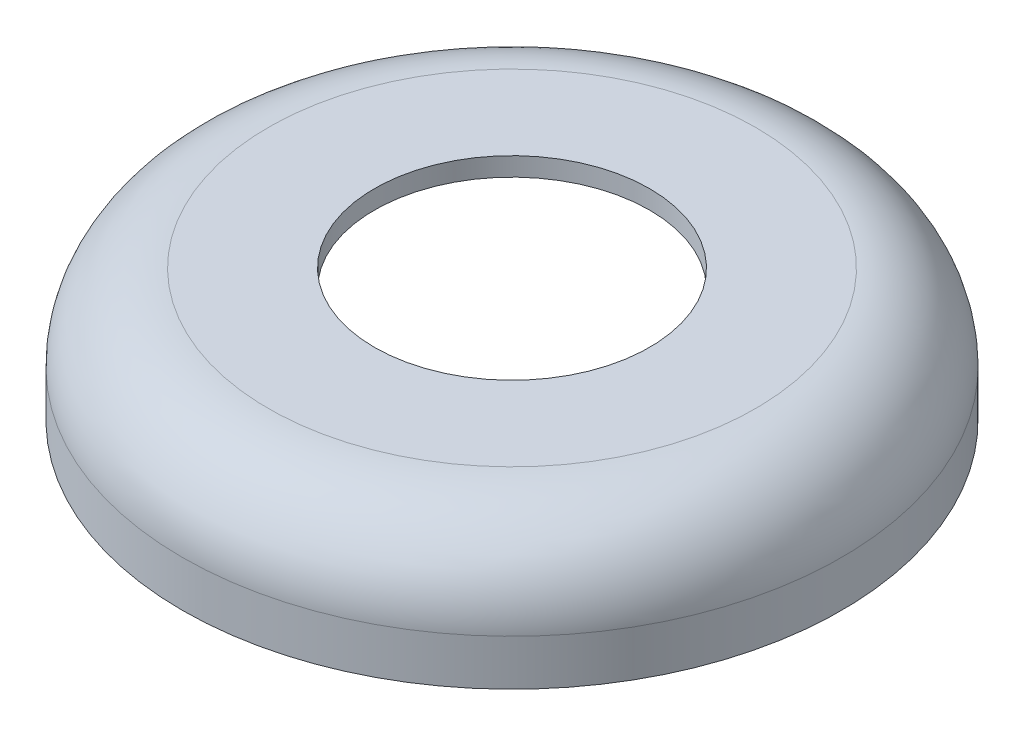
ISO-10303-21;
HEADER;
FILE_DESCRIPTION(('STEP AP214'),'2;1');
FILE_NAME('part.step','',(''),(''),'','','');
FILE_SCHEMA(('AUTOMOTIVE_DESIGN { 1 0 10303 214 1 1 1 1 }'));
ENDSEC;
DATA;
#1=APPLICATION_CONTEXT('core data for automotive mechanical design processes');
#2=APPLICATION_PROTOCOL_DEFINITION('international standard','automotive_design',2000,#1);
#3=PRODUCT_CONTEXT('',#1,'mechanical');
#4=PRODUCT('Part','Part','',(#3));
#5=PRODUCT_RELATED_PRODUCT_CATEGORY('part','',(#4));
#6=PRODUCT_DEFINITION_FORMATION('','',#4);
#7=PRODUCT_DEFINITION_CONTEXT('part definition',#1,'design');
#8=PRODUCT_DEFINITION('design','',#6,#7);
#9=PRODUCT_DEFINITION_SHAPE('','',#8);
#10=(LENGTH_UNIT() NAMED_UNIT(*) SI_UNIT(.MILLI.,.METRE.));
#11=(NAMED_UNIT(*) PLANE_ANGLE_UNIT() SI_UNIT($,.RADIAN.));
#12=(NAMED_UNIT(*) SI_UNIT($,.STERADIAN.) SOLID_ANGLE_UNIT());
#13=UNCERTAINTY_MEASURE_WITH_UNIT(LENGTH_MEASURE(1.E-05),#10,'distance_accuracy_value','');
#14=(GEOMETRIC_REPRESENTATION_CONTEXT(3) GLOBAL_UNCERTAINTY_ASSIGNED_CONTEXT((#13)) GLOBAL_UNIT_ASSIGNED_CONTEXT((#10,
#11,#12)) REPRESENTATION_CONTEXT('',''));
#15=CARTESIAN_POINT('',(0.,0.,0.));
#16=DIRECTION('',(0.,0.,1.));
#17=DIRECTION('',(1.,0.,0.));
#18=AXIS2_PLACEMENT_3D('',#15,#16,#17);
#19=CARTESIAN_POINT('',(0.,4.6,0.));
#20=DIRECTION('',(0.,1.,0.));
#21=DIRECTION('',(0.,0.,1.));
#22=AXIS2_PLACEMENT_3D('',#19,#20,#21);
#23=PLANE('',#22);
#24=CARTESIAN_POINT('',(0.,4.6,0.));
#25=DIRECTION('',(0.,1.,0.));
#26=DIRECTION('',(0.,0.,1.));
#27=AXIS2_PLACEMENT_3D('',#24,#25,#26);
#28=CIRCLE('',#27,4.8);
#29=CARTESIAN_POINT('',(0.,4.6,4.8));
#30=VERTEX_POINT('',#29);
#31=EDGE_CURVE('E56',#30,#30,#28,.T.);
#32=ORIENTED_EDGE('',*,*,#31,.F.);
#33=EDGE_LOOP('',(#32));
#34=FACE_BOUND('',#33,.T.);
#35=CARTESIAN_POINT('',(0.,4.6,0.));
#36=DIRECTION('',(0.,-1.,0.));
#37=DIRECTION('',(0.,0.,-1.));
#38=AXIS2_PLACEMENT_3D('',#35,#36,#37);
#39=CIRCLE('',#38,8.49999999999998);
#40=CARTESIAN_POINT('',(0.,4.6,-8.49999999999998));
#41=VERTEX_POINT('',#40);
#42=EDGE_CURVE('E10',#41,#41,#39,.T.);
#43=ORIENTED_EDGE('',*,*,#42,.F.);
#44=EDGE_LOOP('',(#43));
#45=FACE_BOUND('',#44,.T.);
#46=ADVANCED_FACE('F31',(#34,#45),#23,.T.);
#47=CARTESIAN_POINT('',(0.,1.6,0.));
#48=DIRECTION('',(0.,-1.,0.));
#49=DIRECTION('',(0.,0.,-1.));
#50=AXIS2_PLACEMENT_3D('',#47,#48,#49);
#51=TOROIDAL_SURFACE('',#50,8.5,3.);
#52=ORIENTED_EDGE('',*,*,#42,.T.);
#53=EDGE_LOOP('',(#52));
#54=FACE_BOUND('',#53,.T.);
#55=CARTESIAN_POINT('',(0.,1.59999999999998,0.));
#56=DIRECTION('',(0.,-1.,0.));
#57=DIRECTION('',(0.,0.,-1.));
#58=AXIS2_PLACEMENT_3D('',#55,#56,#57);
#59=CIRCLE('',#58,11.5);
#60=CARTESIAN_POINT('',(0.,1.59999999999998,-11.5));
#61=VERTEX_POINT('',#60);
#62=EDGE_CURVE('E38',#61,#61,#59,.T.);
#63=ORIENTED_EDGE('',*,*,#62,.F.);
#64=EDGE_LOOP('',(#63));
#65=FACE_BOUND('',#64,.T.);
#66=ADVANCED_FACE('F78',(#54,#65),#51,.T.);
#67=CARTESIAN_POINT('',(0.,0.,0.));
#68=DIRECTION('',(0.,-1.,0.));
#69=DIRECTION('',(0.,0.,-1.));
#70=AXIS2_PLACEMENT_3D('',#67,#68,#69);
#71=CYLINDRICAL_SURFACE('',#70,11.5);
#72=ORIENTED_EDGE('',*,*,#62,.T.);
#73=EDGE_LOOP('',(#72));
#74=FACE_BOUND('',#73,.T.);
#75=CARTESIAN_POINT('',(0.,0.,0.));
#76=DIRECTION('',(0.,-1.,0.));
#77=DIRECTION('',(0.,0.,-1.));
#78=AXIS2_PLACEMENT_3D('',#75,#76,#77);
#79=CIRCLE('',#78,11.5);
#80=CARTESIAN_POINT('',(0.,0.,-11.5));
#81=VERTEX_POINT('',#80);
#82=EDGE_CURVE('E42',#81,#81,#79,.T.);
#83=ORIENTED_EDGE('',*,*,#82,.F.);
#84=EDGE_LOOP('',(#83));
#85=FACE_BOUND('',#84,.T.);
#86=ADVANCED_FACE('F83',(#74,#85),#71,.T.);
#87=CARTESIAN_POINT('',(0.,0.,0.));
#88=DIRECTION('',(0.,-1.,0.));
#89=DIRECTION('',(0.,0.,-1.));
#90=AXIS2_PLACEMENT_3D('',#87,#88,#89);
#91=PLANE('',#90);
#92=CARTESIAN_POINT('',(0.,0.,0.));
#93=DIRECTION('',(0.,-1.,0.));
#94=DIRECTION('',(0.,0.,-1.));
#95=AXIS2_PLACEMENT_3D('',#92,#93,#94);
#96=CIRCLE('',#95,10.85);
#97=CARTESIAN_POINT('',(0.,0.,-10.85));
#98=VERTEX_POINT('',#97);
#99=EDGE_CURVE('E48',#98,#98,#96,.T.);
#100=ORIENTED_EDGE('',*,*,#99,.F.);
#101=EDGE_LOOP('',(#100));
#102=FACE_BOUND('',#101,.T.);
#103=ORIENTED_EDGE('',*,*,#82,.T.);
#104=EDGE_LOOP('',(#103));
#105=FACE_BOUND('',#104,.T.);
#106=ADVANCED_FACE('F88',(#102,#105),#91,.T.);
#107=CARTESIAN_POINT('',(0.,3.95,0.));
#108=DIRECTION('',(0.,1.,0.));
#109=DIRECTION('',(0.,0.,1.));
#110=AXIS2_PLACEMENT_3D('',#107,#108,#109);
#111=PLANE('',#110);
#112=CARTESIAN_POINT('',(0.,3.95,0.));
#113=DIRECTION('',(0.,1.,0.));
#114=DIRECTION('',(0.,0.,1.));
#115=AXIS2_PLACEMENT_3D('',#112,#113,#114);
#116=CIRCLE('',#115,4.8);
#117=CARTESIAN_POINT('',(0.,3.95,4.8));
#118=VERTEX_POINT('',#117);
#119=EDGE_CURVE('E34',#118,#118,#116,.T.);
#120=ORIENTED_EDGE('',*,*,#119,.T.);
#121=EDGE_LOOP('',(#120));
#122=FACE_BOUND('',#121,.T.);
#123=CARTESIAN_POINT('',(0.,3.95,0.));
#124=DIRECTION('',(0.,-1.,0.));
#125=DIRECTION('',(0.,0.,-1.));
#126=AXIS2_PLACEMENT_3D('',#123,#124,#125);
#127=CIRCLE('',#126,8.49999999999998);
#128=CARTESIAN_POINT('',(0.,3.95,-8.49999999999998));
#129=VERTEX_POINT('',#128);
#130=EDGE_CURVE('E47',#129,#129,#127,.T.);
#131=ORIENTED_EDGE('',*,*,#130,.T.);
#132=EDGE_LOOP('',(#131));
#133=FACE_BOUND('',#132,.T.);
#134=ADVANCED_FACE('F63',(#122,#133),#111,.F.);
#135=CARTESIAN_POINT('',(0.,1.6,0.));
#136=DIRECTION('',(0.,-1.,0.));
#137=DIRECTION('',(0.,0.,-1.));
#138=AXIS2_PLACEMENT_3D('',#135,#136,#137);
#139=TOROIDAL_SURFACE('',#138,8.5,2.35);
#140=ORIENTED_EDGE('',*,*,#130,.F.);
#141=EDGE_LOOP('',(#140));
#142=FACE_BOUND('',#141,.T.);
#143=CARTESIAN_POINT('',(0.,1.59999999999998,0.));
#144=DIRECTION('',(0.,-1.,0.));
#145=DIRECTION('',(0.,0.,-1.));
#146=AXIS2_PLACEMENT_3D('',#143,#144,#145);
#147=CIRCLE('',#146,10.85);
#148=CARTESIAN_POINT('',(0.,1.59999999999998,-10.85));
#149=VERTEX_POINT('',#148);
#150=EDGE_CURVE('E51',#149,#149,#147,.T.);
#151=ORIENTED_EDGE('',*,*,#150,.T.);
#152=EDGE_LOOP('',(#151));
#153=FACE_BOUND('',#152,.T.);
#154=ADVANCED_FACE('F73',(#142,#153),#139,.F.);
#155=CARTESIAN_POINT('',(0.,0.,0.));
#156=DIRECTION('',(0.,-1.,0.));
#157=DIRECTION('',(0.,0.,-1.));
#158=AXIS2_PLACEMENT_3D('',#155,#156,#157);
#159=CYLINDRICAL_SURFACE('',#158,10.85);
#160=ORIENTED_EDGE('',*,*,#150,.F.);
#161=EDGE_LOOP('',(#160));
#162=FACE_BOUND('',#161,.T.);
#163=ORIENTED_EDGE('',*,*,#99,.T.);
#164=EDGE_LOOP('',(#163));
#165=FACE_BOUND('',#164,.T.);
#166=ADVANCED_FACE('F68',(#162,#165),#159,.F.);
#167=CARTESIAN_POINT('',(0.,-5.4,0.));
#168=DIRECTION('',(0.,1.,0.));
#169=DIRECTION('',(0.,0.,1.));
#170=AXIS2_PLACEMENT_3D('',#167,#168,#169);
#171=CYLINDRICAL_SURFACE('',#170,4.8);
#172=ORIENTED_EDGE('',*,*,#31,.T.);
#173=EDGE_LOOP('',(#172));
#174=FACE_BOUND('',#173,.T.);
#175=ORIENTED_EDGE('',*,*,#119,.F.);
#176=EDGE_LOOP('',(#175));
#177=FACE_BOUND('',#176,.T.);
#178=ADVANCED_FACE('F66',(#174,#177),#171,.F.);
#179=CLOSED_SHELL('',(#46,#66,#86,#106,#134,#154,#166,#178));
#180=MANIFOLD_SOLID_BREP('B2',#179);
#181=ADVANCED_BREP_SHAPE_REPRESENTATION('',(#18,#180),#14);
#182=SHAPE_DEFINITION_REPRESENTATION(#9,#181);
ENDSEC;
END-ISO-10303-21;
